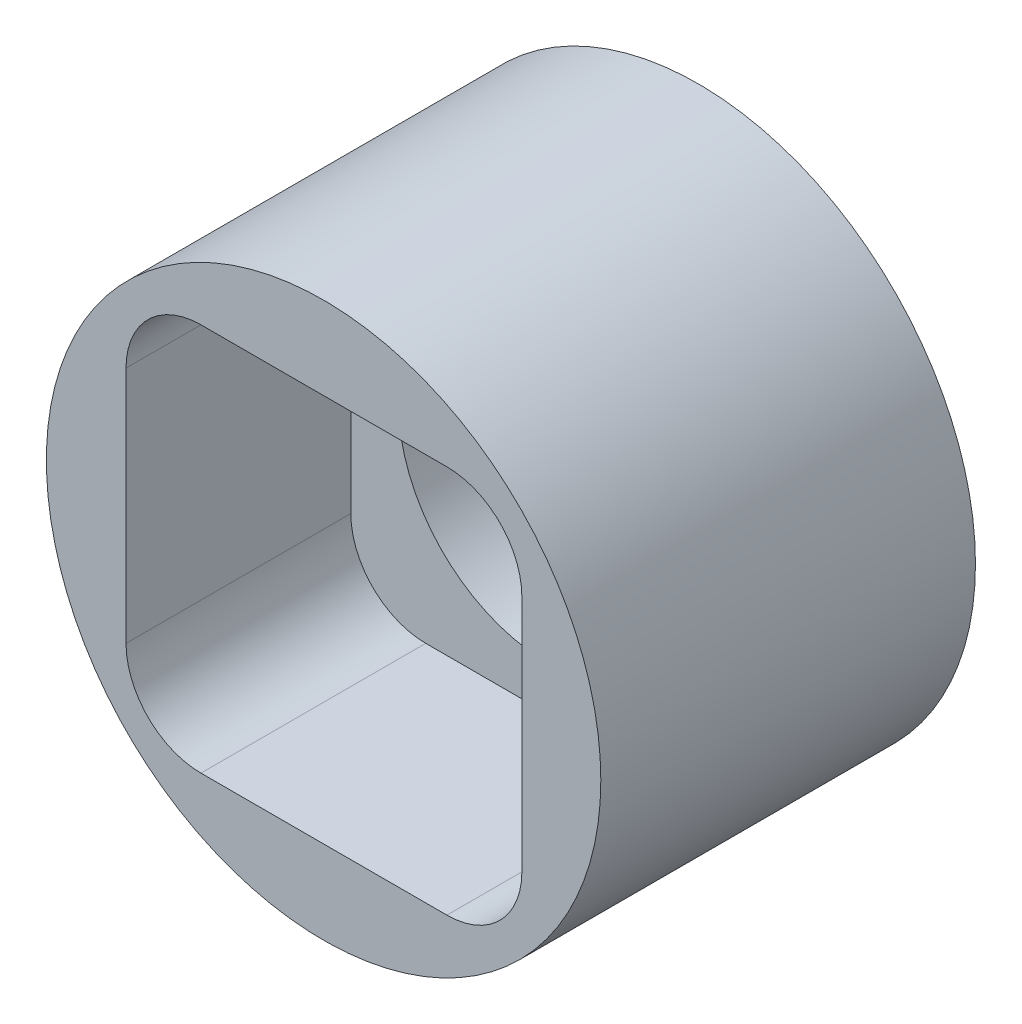
ISO-10303-21;
HEADER;
FILE_DESCRIPTION(('STEP AP214'),'2;1');
FILE_NAME('part.step','',(''),(''),'','','');
FILE_SCHEMA(('AUTOMOTIVE_DESIGN { 1 0 10303 214 1 1 1 1 }'));
ENDSEC;
DATA;
#1=APPLICATION_CONTEXT('core data for automotive mechanical design processes');
#2=APPLICATION_PROTOCOL_DEFINITION('international standard','automotive_design',2000,#1);
#3=PRODUCT_CONTEXT('',#1,'mechanical');
#4=PRODUCT('Part','Part','',(#3));
#5=PRODUCT_RELATED_PRODUCT_CATEGORY('part','',(#4));
#6=PRODUCT_DEFINITION_FORMATION('','',#4);
#7=PRODUCT_DEFINITION_CONTEXT('part definition',#1,'design');
#8=PRODUCT_DEFINITION('design','',#6,#7);
#9=PRODUCT_DEFINITION_SHAPE('','',#8);
#10=(LENGTH_UNIT() NAMED_UNIT(*) SI_UNIT(.MILLI.,.METRE.));
#11=(NAMED_UNIT(*) PLANE_ANGLE_UNIT() SI_UNIT($,.RADIAN.));
#12=(NAMED_UNIT(*) SI_UNIT($,.STERADIAN.) SOLID_ANGLE_UNIT());
#13=UNCERTAINTY_MEASURE_WITH_UNIT(LENGTH_MEASURE(1.E-05),#10,'distance_accuracy_value','');
#14=(GEOMETRIC_REPRESENTATION_CONTEXT(3) GLOBAL_UNCERTAINTY_ASSIGNED_CONTEXT((#13)) GLOBAL_UNIT_ASSIGNED_CONTEXT((#10,
#11,#12)) REPRESENTATION_CONTEXT('',''));
#15=CARTESIAN_POINT('',(0.,0.,0.));
#16=DIRECTION('',(0.,0.,1.));
#17=DIRECTION('',(1.,0.,0.));
#18=AXIS2_PLACEMENT_3D('',#15,#16,#17);
#19=CARTESIAN_POINT('',(0.,0.,5.));
#20=DIRECTION('',(0.,0.,-1.));
#21=DIRECTION('',(-1.,0.,0.));
#22=AXIS2_PLACEMENT_3D('',#19,#20,#21);
#23=CYLINDRICAL_SURFACE('',#22,3.7);
#24=CARTESIAN_POINT('',(0.,0.,5.));
#25=DIRECTION('',(0.,0.,1.));
#26=DIRECTION('',(1.,0.,0.));
#27=AXIS2_PLACEMENT_3D('',#24,#25,#26);
#28=CIRCLE('',#27,3.7);
#29=CARTESIAN_POINT('',(3.7,0.,5.));
#30=VERTEX_POINT('',#29);
#31=EDGE_CURVE('E11',#30,#30,#28,.T.);
#32=ORIENTED_EDGE('',*,*,#31,.F.);
#33=EDGE_LOOP('',(#32));
#34=FACE_BOUND('',#33,.T.);
#35=CARTESIAN_POINT('',(0.,0.,0.));
#36=DIRECTION('',(0.,0.,1.));
#37=DIRECTION('',(1.,0.,0.));
#38=AXIS2_PLACEMENT_3D('',#35,#36,#37);
#39=CIRCLE('',#38,3.7);
#40=CARTESIAN_POINT('',(3.7,0.,0.));
#41=VERTEX_POINT('',#40);
#42=EDGE_CURVE('E50',#41,#41,#39,.T.);
#43=ORIENTED_EDGE('',*,*,#42,.T.);
#44=EDGE_LOOP('',(#43));
#45=FACE_BOUND('',#44,.T.);
#46=ADVANCED_FACE('F47',(#34,#45),#23,.T.);
#47=CARTESIAN_POINT('',(0.,0.,5.));
#48=DIRECTION('',(0.,0.,1.));
#49=DIRECTION('',(1.,0.,0.));
#50=AXIS2_PLACEMENT_3D('',#47,#48,#49);
#51=PLANE('',#50);
#52=CARTESIAN_POINT('',(1.6461926488838,-1.58605190686369,5.));
#53=DIRECTION('',(0.,0.,1.));
#54=DIRECTION('',(1.,0.,0.));
#55=AXIS2_PLACEMENT_3D('',#52,#53,#54);
#56=CIRCLE('',#55,1.);
#57=CARTESIAN_POINT('',(1.64619264888379,-2.58605190686369,5.));
#58=VERTEX_POINT('',#57);
#59=CARTESIAN_POINT('',(2.6461926488838,-1.58605190686369,5.));
#60=VERTEX_POINT('',#59);
#61=EDGE_CURVE('E61',#58,#60,#56,.T.);
#62=ORIENTED_EDGE('',*,*,#61,.F.);
#63=DIRECTION('',(1.,0.,0.));
#64=VECTOR('',#63,1.);
#65=CARTESIAN_POINT('',(-1.63686373211679,-2.58605190686369,5.));
#66=LINE('',#65,#64);
#67=CARTESIAN_POINT('',(-1.63686373211679,-2.58605190686369,5.));
#68=VERTEX_POINT('',#67);
#69=EDGE_CURVE('E163',#68,#58,#66,.T.);
#70=ORIENTED_EDGE('',*,*,#69,.F.);
#71=CARTESIAN_POINT('',(-1.6368637321168,-1.58605190686369,5.));
#72=DIRECTION('',(0.,0.,1.));
#73=DIRECTION('',(1.,0.,0.));
#74=AXIS2_PLACEMENT_3D('',#71,#72,#73);
#75=CIRCLE('',#74,1.);
#76=CARTESIAN_POINT('',(-2.6368637321168,-1.58605190686369,5.));
#77=VERTEX_POINT('',#76);
#78=EDGE_CURVE('E161',#77,#68,#75,.T.);
#79=ORIENTED_EDGE('',*,*,#78,.F.);
#80=DIRECTION('',(0.,-1.,0.));
#81=VECTOR('',#80,1.);
#82=CARTESIAN_POINT('',(-2.6368637321168,1.5955634567945,5.));
#83=LINE('',#82,#81);
#84=CARTESIAN_POINT('',(-2.6368637321168,1.5955634567945,5.));
#85=VERTEX_POINT('',#84);
#86=EDGE_CURVE('E121',#85,#77,#83,.T.);
#87=ORIENTED_EDGE('',*,*,#86,.F.);
#88=CARTESIAN_POINT('',(-1.6368637321168,1.59556345679451,5.));
#89=DIRECTION('',(0.,0.,1.));
#90=DIRECTION('',(1.,0.,0.));
#91=AXIS2_PLACEMENT_3D('',#88,#89,#90);
#92=CIRCLE('',#91,1.);
#93=CARTESIAN_POINT('',(-1.63686373211679,2.59556345679451,5.));
#94=VERTEX_POINT('',#93);
#95=EDGE_CURVE('E157',#94,#85,#92,.T.);
#96=ORIENTED_EDGE('',*,*,#95,.F.);
#97=DIRECTION('',(-1.,0.,0.));
#98=VECTOR('',#97,1.);
#99=CARTESIAN_POINT('',(-1.63686373211679,2.59556345679451,5.));
#100=LINE('',#99,#98);
#101=CARTESIAN_POINT('',(1.64619264888379,2.59556345679451,5.));
#102=VERTEX_POINT('',#101);
#103=EDGE_CURVE('E154',#102,#94,#100,.T.);
#104=ORIENTED_EDGE('',*,*,#103,.F.);
#105=CARTESIAN_POINT('',(1.6461926488838,1.59556345679451,5.));
#106=DIRECTION('',(0.,0.,1.));
#107=DIRECTION('',(-1.,0.,0.));
#108=AXIS2_PLACEMENT_3D('',#105,#106,#107);
#109=CIRCLE('',#108,1.);
#110=CARTESIAN_POINT('',(2.6461926488838,1.5955634567945,5.));
#111=VERTEX_POINT('',#110);
#112=EDGE_CURVE('E151',#111,#102,#109,.T.);
#113=ORIENTED_EDGE('',*,*,#112,.F.);
#114=DIRECTION('',(0.,1.,0.));
#115=VECTOR('',#114,1.);
#116=CARTESIAN_POINT('',(2.6461926488838,1.5955634567945,5.));
#117=LINE('',#116,#115);
#118=EDGE_CURVE('E147',#60,#111,#117,.T.);
#119=ORIENTED_EDGE('',*,*,#118,.F.);
#120=EDGE_LOOP('',(#62,#70,#79,#87,#96,#104,#113,#119));
#121=FACE_BOUND('',#120,.T.);
#122=ORIENTED_EDGE('',*,*,#31,.T.);
#123=EDGE_LOOP('',(#122));
#124=FACE_BOUND('',#123,.T.);
#125=ADVANCED_FACE('F182',(#121,#124),#51,.T.);
#126=CARTESIAN_POINT('',(0.,0.,0.));
#127=DIRECTION('',(0.,0.,1.));
#128=DIRECTION('',(1.,0.,0.));
#129=AXIS2_PLACEMENT_3D('',#126,#127,#128);
#130=PLANE('',#129);
#131=CARTESIAN_POINT('',(0.,0.,0.));
#132=DIRECTION('',(0.,0.,1.));
#133=DIRECTION('',(1.,0.,0.));
#134=AXIS2_PLACEMENT_3D('',#131,#132,#133);
#135=CIRCLE('',#134,2.);
#136=CARTESIAN_POINT('',(2.,0.,0.));
#137=VERTEX_POINT('',#136);
#138=EDGE_CURVE('E148',#137,#137,#135,.T.);
#139=ORIENTED_EDGE('',*,*,#138,.T.);
#140=EDGE_LOOP('',(#139));
#141=FACE_BOUND('',#140,.T.);
#142=ORIENTED_EDGE('',*,*,#42,.F.);
#143=EDGE_LOOP('',(#142));
#144=FACE_BOUND('',#143,.T.);
#145=ADVANCED_FACE('F210',(#141,#144),#130,.F.);
#146=CARTESIAN_POINT('',(1.6461926488838,-1.58605190686369,2.));
#147=DIRECTION('',(0.,0.,1.));
#148=DIRECTION('',(1.,0.,0.));
#149=AXIS2_PLACEMENT_3D('',#146,#147,#148);
#150=CYLINDRICAL_SURFACE('',#149,1.);
#151=ORIENTED_EDGE('',*,*,#61,.T.);
#152=DIRECTION('',(0.,0.,1.));
#153=VECTOR('',#152,1.);
#154=CARTESIAN_POINT('',(2.6461926488838,-1.58605190686369,2.));
#155=LINE('',#154,#153);
#156=CARTESIAN_POINT('',(2.6461926488838,-1.58605190686369,2.));
#157=VERTEX_POINT('',#156);
#158=EDGE_CURVE('E97',#157,#60,#155,.T.);
#159=ORIENTED_EDGE('',*,*,#158,.F.);
#160=CARTESIAN_POINT('',(1.6461926488838,-1.58605190686369,2.));
#161=DIRECTION('',(0.,0.,1.));
#162=DIRECTION('',(1.,0.,0.));
#163=AXIS2_PLACEMENT_3D('',#160,#161,#162);
#164=CIRCLE('',#163,1.);
#165=CARTESIAN_POINT('',(1.64619264888379,-2.58605190686369,2.));
#166=VERTEX_POINT('',#165);
#167=EDGE_CURVE('E165',#166,#157,#164,.T.);
#168=ORIENTED_EDGE('',*,*,#167,.F.);
#169=DIRECTION('',(0.,0.,1.));
#170=VECTOR('',#169,1.);
#171=CARTESIAN_POINT('',(1.64619264888379,-2.58605190686369,2.));
#172=LINE('',#171,#170);
#173=EDGE_CURVE('E69',#166,#58,#172,.T.);
#174=ORIENTED_EDGE('',*,*,#173,.T.);
#175=EDGE_LOOP('',(#151,#159,#168,#174));
#176=FACE_BOUND('',#175,.T.);
#177=ADVANCED_FACE('F203',(#176),#150,.F.);
#178=CARTESIAN_POINT('',(-1.63686373211679,-2.58605190686369,2.));
#179=DIRECTION('',(0.,-1.,0.));
#180=DIRECTION('',(0.,0.,-1.));
#181=AXIS2_PLACEMENT_3D('',#178,#179,#180);
#182=PLANE('',#181);
#183=ORIENTED_EDGE('',*,*,#69,.T.);
#184=ORIENTED_EDGE('',*,*,#173,.F.);
#185=DIRECTION('',(1.,0.,0.));
#186=VECTOR('',#185,1.);
#187=CARTESIAN_POINT('',(-1.63686373211679,-2.58605190686369,2.));
#188=LINE('',#187,#186);
#189=CARTESIAN_POINT('',(-1.63686373211679,-2.58605190686369,2.));
#190=VERTEX_POINT('',#189);
#191=EDGE_CURVE('E133',#190,#166,#188,.T.);
#192=ORIENTED_EDGE('',*,*,#191,.F.);
#193=DIRECTION('',(0.,0.,1.));
#194=VECTOR('',#193,1.);
#195=CARTESIAN_POINT('',(-1.63686373211679,-2.58605190686369,2.));
#196=LINE('',#195,#194);
#197=EDGE_CURVE('E125',#190,#68,#196,.T.);
#198=ORIENTED_EDGE('',*,*,#197,.T.);
#199=EDGE_LOOP('',(#183,#184,#192,#198));
#200=FACE_BOUND('',#199,.T.);
#201=ADVANCED_FACE('F201',(#200),#182,.F.);
#202=CARTESIAN_POINT('',(-1.6368637321168,-1.58605190686369,2.));
#203=DIRECTION('',(0.,0.,1.));
#204=DIRECTION('',(1.,0.,0.));
#205=AXIS2_PLACEMENT_3D('',#202,#203,#204);
#206=CYLINDRICAL_SURFACE('',#205,1.);
#207=ORIENTED_EDGE('',*,*,#78,.T.);
#208=ORIENTED_EDGE('',*,*,#197,.F.);
#209=CARTESIAN_POINT('',(-1.6368637321168,-1.58605190686369,2.));
#210=DIRECTION('',(0.,0.,1.));
#211=DIRECTION('',(1.,0.,0.));
#212=AXIS2_PLACEMENT_3D('',#209,#210,#211);
#213=CIRCLE('',#212,1.);
#214=CARTESIAN_POINT('',(-2.6368637321168,-1.58605190686369,2.));
#215=VERTEX_POINT('',#214);
#216=EDGE_CURVE('E129',#215,#190,#213,.T.);
#217=ORIENTED_EDGE('',*,*,#216,.F.);
#218=DIRECTION('',(0.,0.,1.));
#219=VECTOR('',#218,1.);
#220=CARTESIAN_POINT('',(-2.6368637321168,-1.58605190686369,2.));
#221=LINE('',#220,#219);
#222=EDGE_CURVE('E114',#215,#77,#221,.T.);
#223=ORIENTED_EDGE('',*,*,#222,.T.);
#224=EDGE_LOOP('',(#207,#208,#217,#223));
#225=FACE_BOUND('',#224,.T.);
#226=ADVANCED_FACE('F130',(#225),#206,.F.);
#227=CARTESIAN_POINT('',(-2.6368637321168,1.5955634567945,2.));
#228=DIRECTION('',(-1.,0.,0.));
#229=DIRECTION('',(0.,0.,1.));
#230=AXIS2_PLACEMENT_3D('',#227,#228,#229);
#231=PLANE('',#230);
#232=ORIENTED_EDGE('',*,*,#86,.T.);
#233=ORIENTED_EDGE('',*,*,#222,.F.);
#234=DIRECTION('',(0.,-1.,0.));
#235=VECTOR('',#234,1.);
#236=CARTESIAN_POINT('',(-2.6368637321168,1.5955634567945,2.));
#237=LINE('',#236,#235);
#238=CARTESIAN_POINT('',(-2.6368637321168,1.5955634567945,2.));
#239=VERTEX_POINT('',#238);
#240=EDGE_CURVE('E118',#239,#215,#237,.T.);
#241=ORIENTED_EDGE('',*,*,#240,.F.);
#242=DIRECTION('',(0.,0.,1.));
#243=VECTOR('',#242,1.);
#244=CARTESIAN_POINT('',(-2.6368637321168,1.5955634567945,2.));
#245=LINE('',#244,#243);
#246=EDGE_CURVE('E126',#239,#85,#245,.T.);
#247=ORIENTED_EDGE('',*,*,#246,.T.);
#248=EDGE_LOOP('',(#232,#233,#241,#247));
#249=FACE_BOUND('',#248,.T.);
#250=ADVANCED_FACE('F116',(#249),#231,.F.);
#251=CARTESIAN_POINT('',(-1.6368637321168,1.59556345679451,2.));
#252=DIRECTION('',(0.,0.,1.));
#253=DIRECTION('',(1.,0.,0.));
#254=AXIS2_PLACEMENT_3D('',#251,#252,#253);
#255=CYLINDRICAL_SURFACE('',#254,1.);
#256=ORIENTED_EDGE('',*,*,#95,.T.);
#257=ORIENTED_EDGE('',*,*,#246,.F.);
#258=CARTESIAN_POINT('',(-1.6368637321168,1.59556345679451,2.));
#259=DIRECTION('',(0.,0.,1.));
#260=DIRECTION('',(1.,0.,0.));
#261=AXIS2_PLACEMENT_3D('',#258,#259,#260);
#262=CIRCLE('',#261,1.);
#263=CARTESIAN_POINT('',(-1.63686373211679,2.59556345679451,2.));
#264=VERTEX_POINT('',#263);
#265=EDGE_CURVE('E139',#264,#239,#262,.T.);
#266=ORIENTED_EDGE('',*,*,#265,.F.);
#267=DIRECTION('',(0.,0.,1.));
#268=VECTOR('',#267,1.);
#269=CARTESIAN_POINT('',(-1.63686373211679,2.59556345679451,2.));
#270=LINE('',#269,#268);
#271=EDGE_CURVE('E169',#264,#94,#270,.T.);
#272=ORIENTED_EDGE('',*,*,#271,.T.);
#273=EDGE_LOOP('',(#256,#257,#266,#272));
#274=FACE_BOUND('',#273,.T.);
#275=ADVANCED_FACE('F200',(#274),#255,.F.);
#276=CARTESIAN_POINT('',(-1.63686373211679,2.59556345679451,2.));
#277=DIRECTION('',(0.,1.,0.));
#278=DIRECTION('',(0.,0.,1.));
#279=AXIS2_PLACEMENT_3D('',#276,#277,#278);
#280=PLANE('',#279);
#281=ORIENTED_EDGE('',*,*,#103,.T.);
#282=ORIENTED_EDGE('',*,*,#271,.F.);
#283=DIRECTION('',(-1.,0.,0.));
#284=VECTOR('',#283,1.);
#285=CARTESIAN_POINT('',(-1.63686373211679,2.59556345679451,2.));
#286=LINE('',#285,#284);
#287=CARTESIAN_POINT('',(1.64619264888379,2.59556345679451,2.));
#288=VERTEX_POINT('',#287);
#289=EDGE_CURVE('E141',#288,#264,#286,.T.);
#290=ORIENTED_EDGE('',*,*,#289,.F.);
#291=DIRECTION('',(0.,0.,1.));
#292=VECTOR('',#291,1.);
#293=CARTESIAN_POINT('',(1.64619264888379,2.59556345679451,2.));
#294=LINE('',#293,#292);
#295=EDGE_CURVE('E171',#288,#102,#294,.T.);
#296=ORIENTED_EDGE('',*,*,#295,.T.);
#297=EDGE_LOOP('',(#281,#282,#290,#296));
#298=FACE_BOUND('',#297,.T.);
#299=ADVANCED_FACE('F198',(#298),#280,.F.);
#300=CARTESIAN_POINT('',(1.6461926488838,1.59556345679451,2.));
#301=DIRECTION('',(0.,0.,1.));
#302=DIRECTION('',(1.,0.,0.));
#303=AXIS2_PLACEMENT_3D('',#300,#301,#302);
#304=CYLINDRICAL_SURFACE('',#303,1.);
#305=ORIENTED_EDGE('',*,*,#112,.T.);
#306=ORIENTED_EDGE('',*,*,#295,.F.);
#307=CARTESIAN_POINT('',(1.6461926488838,1.59556345679451,2.));
#308=DIRECTION('',(0.,0.,1.));
#309=DIRECTION('',(-1.,0.,0.));
#310=AXIS2_PLACEMENT_3D('',#307,#308,#309);
#311=CIRCLE('',#310,1.);
#312=CARTESIAN_POINT('',(2.6461926488838,1.5955634567945,2.));
#313=VERTEX_POINT('',#312);
#314=EDGE_CURVE('E192',#313,#288,#311,.T.);
#315=ORIENTED_EDGE('',*,*,#314,.F.);
#316=DIRECTION('',(0.,0.,1.));
#317=VECTOR('',#316,1.);
#318=CARTESIAN_POINT('',(2.6461926488838,1.5955634567945,2.));
#319=LINE('',#318,#317);
#320=EDGE_CURVE('E173',#313,#111,#319,.T.);
#321=ORIENTED_EDGE('',*,*,#320,.T.);
#322=EDGE_LOOP('',(#305,#306,#315,#321));
#323=FACE_BOUND('',#322,.T.);
#324=ADVANCED_FACE('F188',(#323),#304,.F.);
#325=CARTESIAN_POINT('',(2.6461926488838,1.5955634567945,2.));
#326=DIRECTION('',(1.,0.,0.));
#327=DIRECTION('',(0.,0.,-1.));
#328=AXIS2_PLACEMENT_3D('',#325,#326,#327);
#329=PLANE('',#328);
#330=ORIENTED_EDGE('',*,*,#118,.T.);
#331=ORIENTED_EDGE('',*,*,#320,.F.);
#332=DIRECTION('',(0.,1.,0.));
#333=VECTOR('',#332,1.);
#334=CARTESIAN_POINT('',(2.6461926488838,1.5955634567945,2.));
#335=LINE('',#334,#333);
#336=EDGE_CURVE('E180',#157,#313,#335,.T.);
#337=ORIENTED_EDGE('',*,*,#336,.F.);
#338=ORIENTED_EDGE('',*,*,#158,.T.);
#339=EDGE_LOOP('',(#330,#331,#337,#338));
#340=FACE_BOUND('',#339,.T.);
#341=ADVANCED_FACE('F177',(#340),#329,.F.);
#342=CARTESIAN_POINT('',(1.6461926488838,-1.58605190686369,2.));
#343=DIRECTION('',(0.,0.,1.));
#344=DIRECTION('',(1.,0.,0.));
#345=AXIS2_PLACEMENT_3D('',#342,#343,#344);
#346=PLANE('',#345);
#347=CARTESIAN_POINT('',(0.,0.,2.));
#348=DIRECTION('',(0.,0.,1.));
#349=DIRECTION('',(1.,0.,0.));
#350=AXIS2_PLACEMENT_3D('',#347,#348,#349);
#351=CIRCLE('',#350,2.);
#352=CARTESIAN_POINT('',(2.,0.,2.));
#353=VERTEX_POINT('',#352);
#354=EDGE_CURVE('E291',#353,#353,#351,.T.);
#355=ORIENTED_EDGE('',*,*,#354,.F.);
#356=EDGE_LOOP('',(#355));
#357=FACE_BOUND('',#356,.T.);
#358=ORIENTED_EDGE('',*,*,#167,.T.);
#359=ORIENTED_EDGE('',*,*,#336,.T.);
#360=ORIENTED_EDGE('',*,*,#314,.T.);
#361=ORIENTED_EDGE('',*,*,#289,.T.);
#362=ORIENTED_EDGE('',*,*,#265,.T.);
#363=ORIENTED_EDGE('',*,*,#240,.T.);
#364=ORIENTED_EDGE('',*,*,#216,.T.);
#365=ORIENTED_EDGE('',*,*,#191,.T.);
#366=EDGE_LOOP('',(#358,#359,#360,#361,#362,#363,#364,#365));
#367=FACE_BOUND('',#366,.T.);
#368=ADVANCED_FACE('F136',(#357,#367),#346,.T.);
#369=CARTESIAN_POINT('',(0.,0.,0.));
#370=DIRECTION('',(0.,0.,1.));
#371=DIRECTION('',(1.,0.,0.));
#372=AXIS2_PLACEMENT_3D('',#369,#370,#371);
#373=CYLINDRICAL_SURFACE('',#372,2.);
#374=ORIENTED_EDGE('',*,*,#138,.F.);
#375=EDGE_LOOP('',(#374));
#376=FACE_BOUND('',#375,.T.);
#377=ORIENTED_EDGE('',*,*,#354,.T.);
#378=EDGE_LOOP('',(#377));
#379=FACE_BOUND('',#378,.T.);
#380=ADVANCED_FACE('F274',(#376,#379),#373,.F.);
#381=CLOSED_SHELL('',(#46,#125,#145,#177,#201,#226,#250,#275,#299,#324,#341,#368,#380));
#382=MANIFOLD_SOLID_BREP('B2',#381);
#383=ADVANCED_BREP_SHAPE_REPRESENTATION('',(#18,#382),#14);
#384=SHAPE_DEFINITION_REPRESENTATION(#9,#383);
ENDSEC;
END-ISO-10303-21;
